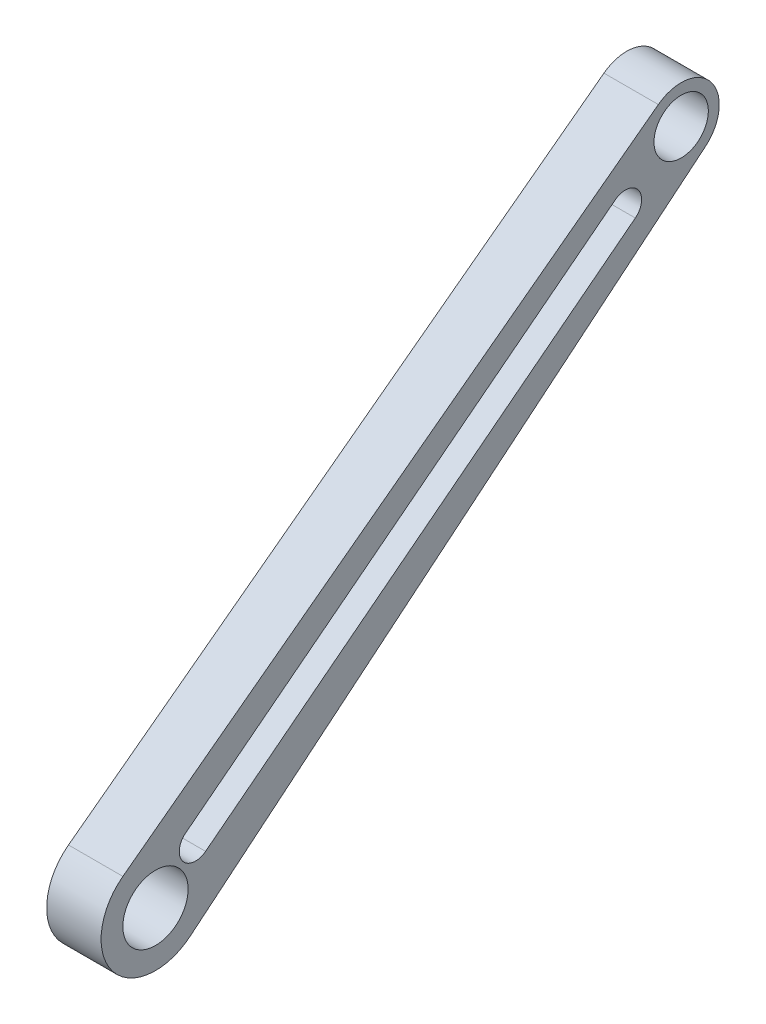
ISO-10303-21;
HEADER;
FILE_DESCRIPTION(('STEP AP214'),'2;1');
FILE_NAME('part.step','',(''),(''),'','','');
FILE_SCHEMA(('AUTOMOTIVE_DESIGN { 1 0 10303 214 1 1 1 1 }'));
ENDSEC;
DATA;
#1=APPLICATION_CONTEXT('core data for automotive mechanical design processes');
#2=APPLICATION_PROTOCOL_DEFINITION('international standard','automotive_design',2000,#1);
#3=PRODUCT_CONTEXT('',#1,'mechanical');
#4=PRODUCT('Part','Part','',(#3));
#5=PRODUCT_RELATED_PRODUCT_CATEGORY('part','',(#4));
#6=PRODUCT_DEFINITION_FORMATION('','',#4);
#7=PRODUCT_DEFINITION_CONTEXT('part definition',#1,'design');
#8=PRODUCT_DEFINITION('design','',#6,#7);
#9=PRODUCT_DEFINITION_SHAPE('','',#8);
#10=(LENGTH_UNIT() NAMED_UNIT(*) SI_UNIT(.MILLI.,.METRE.));
#11=(NAMED_UNIT(*) PLANE_ANGLE_UNIT() SI_UNIT($,.RADIAN.));
#12=(NAMED_UNIT(*) SI_UNIT($,.STERADIAN.) SOLID_ANGLE_UNIT());
#13=UNCERTAINTY_MEASURE_WITH_UNIT(LENGTH_MEASURE(1.E-05),#10,'distance_accuracy_value','');
#14=(GEOMETRIC_REPRESENTATION_CONTEXT(3) GLOBAL_UNCERTAINTY_ASSIGNED_CONTEXT((#13)) GLOBAL_UNIT_ASSIGNED_CONTEXT((#10,
#11,#12)) REPRESENTATION_CONTEXT('',''));
#15=CARTESIAN_POINT('',(0.,0.,0.));
#16=DIRECTION('',(0.,0.,1.));
#17=DIRECTION('',(1.,0.,0.));
#18=AXIS2_PLACEMENT_3D('',#15,#16,#17);
#19=CARTESIAN_POINT('',(50.,0.,0.));
#20=DIRECTION('',(1.,0.,0.));
#21=DIRECTION('',(0.,0.,-1.));
#22=AXIS2_PLACEMENT_3D('',#19,#20,#21);
#23=PLANE('',#22);
#24=CARTESIAN_POINT('',(50.,0.,0.));
#25=DIRECTION('',(1.,0.,0.));
#26=DIRECTION('',(0.,0.,-1.));
#27=AXIS2_PLACEMENT_3D('',#24,#25,#26);
#28=CIRCLE('',#27,30.);
#29=CARTESIAN_POINT('',(50.,0.,-30.));
#30=VERTEX_POINT('',#29);
#31=EDGE_CURVE('E167',#30,#30,#28,.T.);
#32=ORIENTED_EDGE('',*,*,#31,.F.);
#33=EDGE_LOOP('',(#32));
#34=FACE_BOUND('',#33,.T.);
#35=CARTESIAN_POINT('',(50.,0.,0.));
#36=DIRECTION('',(1.,0.,0.));
#37=DIRECTION('',(0.,0.,-1.));
#38=AXIS2_PLACEMENT_3D('',#35,#36,#37);
#39=CIRCLE('',#38,50.);
#40=CARTESIAN_POINT('',(50.,40.0318957961058,29.9574251058019));
#41=VERTEX_POINT('',#40);
#42=CARTESIAN_POINT('',(50.,-38.5229715412484,-31.8744515816691));
#43=VERTEX_POINT('',#42);
#44=EDGE_CURVE('E175',#41,#43,#39,.T.);
#45=ORIENTED_EDGE('',*,*,#44,.T.);
#46=DIRECTION('',(0.,0.637489031633381,-0.770459430824968));
#47=VECTOR('',#46,1.);
#48=CARTESIAN_POINT('',(50.,-38.5229715412484,-31.8744515816691));
#49=LINE('',#48,#47);
#50=CARTESIAN_POINT('',(50.,353.31720598936,-505.446458587129));
#51=VERTEX_POINT('',#50);
#52=EDGE_CURVE('E179',#43,#51,#49,.T.);
#53=ORIENTED_EDGE('',*,*,#52,.T.);
#54=CARTESIAN_POINT('',(50.,380.283286068234,-483.134342479961));
#55=DIRECTION('',(1.,0.,0.));
#56=DIRECTION('',(0.,0.,-1.));
#57=AXIS2_PLACEMENT_3D('',#54,#55,#56);
#58=CIRCLE('',#57,35.);
#59=CARTESIAN_POINT('',(50.,408.305613125508,-462.1641449059));
#60=VERTEX_POINT('',#59);
#61=EDGE_CURVE('E183',#51,#60,#58,.T.);
#62=ORIENTED_EDGE('',*,*,#61,.T.);
#63=DIRECTION('',(0.,-0.599148502116037,0.800637915922116));
#64=VECTOR('',#63,1.);
#65=CARTESIAN_POINT('',(50.,40.0318957961058,29.9574251058019));
#66=LINE('',#65,#64);
#67=EDGE_CURVE('E186',#60,#41,#66,.T.);
#68=ORIENTED_EDGE('',*,*,#67,.T.);
#69=EDGE_LOOP('',(#45,#53,#62,#68));
#70=FACE_BOUND('',#69,.T.);
#71=CARTESIAN_POINT('',(50.,380.283286068234,-483.134342479961));
#72=DIRECTION('',(1.,0.,0.));
#73=DIRECTION('',(0.,0.,-1.));
#74=AXIS2_PLACEMENT_3D('',#71,#72,#73);
#75=CIRCLE('',#74,24.9999999999999);
#76=CARTESIAN_POINT('',(50.,380.283286068234,-508.134342479961));
#77=VERTEX_POINT('',#76);
#78=EDGE_CURVE('E159',#77,#77,#75,.T.);
#79=ORIENTED_EDGE('',*,*,#78,.F.);
#80=EDGE_LOOP('',(#79));
#81=FACE_BOUND('',#80,.T.);
#82=DIRECTION('',(0.,0.613241553660751,-0.789895434132739));
#83=VECTOR('',#82,1.);
#84=CARTESIAN_POINT('',(50.,21.953376737919,-46.0420454998745));
#85=LINE('',#84,#83);
#86=CARTESIAN_POINT('',(50.,21.953376737919,-46.0420454998745));
#87=VERTEX_POINT('',#86);
#88=CARTESIAN_POINT('',(50.,328.574153568294,-440.989762566244));
#89=VERTEX_POINT('',#88);
#90=EDGE_CURVE('E118',#87,#89,#85,.T.);
#91=ORIENTED_EDGE('',*,*,#90,.F.);
#92=CARTESIAN_POINT('',(50.,33.8018082499101,-36.8434221949633));
#93=DIRECTION('',(1.,0.,0.));
#94=DIRECTION('',(0.,0.,-1.));
#95=AXIS2_PLACEMENT_3D('',#92,#93,#94);
#96=CIRCLE('',#95,15.);
#97=CARTESIAN_POINT('',(50.,45.6502397619012,-27.644798890052));
#98=VERTEX_POINT('',#97);
#99=EDGE_CURVE('E109',#98,#87,#96,.T.);
#100=ORIENTED_EDGE('',*,*,#99,.F.);
#101=DIRECTION('',(0.,-0.613241553660751,0.789895434132739));
#102=VECTOR('',#101,1.);
#103=CARTESIAN_POINT('',(50.,45.6502397619012,-27.644798890052));
#104=LINE('',#103,#102);
#105=CARTESIAN_POINT('',(50.,352.271016592277,-422.592515956422));
#106=VERTEX_POINT('',#105);
#107=EDGE_CURVE('E137',#106,#98,#104,.T.);
#108=ORIENTED_EDGE('',*,*,#107,.F.);
#109=CARTESIAN_POINT('',(50.,340.422585080286,-431.791139261333));
#110=DIRECTION('',(1.,0.,0.));
#111=DIRECTION('',(0.,0.,-1.));
#112=AXIS2_PLACEMENT_3D('',#109,#110,#111);
#113=CIRCLE('',#112,15.);
#114=EDGE_CURVE('E131',#89,#106,#113,.T.);
#115=ORIENTED_EDGE('',*,*,#114,.F.);
#116=EDGE_LOOP('',(#91,#100,#108,#115));
#117=FACE_BOUND('',#116,.T.);
#118=ADVANCED_FACE('F43',(#34,#70,#81,#117),#23,.T.);
#119=CARTESIAN_POINT('',(0.,0.,0.));
#120=DIRECTION('',(1.,0.,0.));
#121=DIRECTION('',(0.,0.,-1.));
#122=AXIS2_PLACEMENT_3D('',#119,#120,#121);
#123=PLANE('',#122);
#124=CARTESIAN_POINT('',(0.,380.283286068234,-483.134342479961));
#125=DIRECTION('',(1.,0.,0.));
#126=DIRECTION('',(0.,0.,-1.));
#127=AXIS2_PLACEMENT_3D('',#124,#125,#126);
#128=CIRCLE('',#127,24.9999999999999);
#129=CARTESIAN_POINT('',(0.,380.283286068234,-508.134342479961));
#130=VERTEX_POINT('',#129);
#131=EDGE_CURVE('E127',#130,#130,#128,.T.);
#132=ORIENTED_EDGE('',*,*,#131,.T.);
#133=EDGE_LOOP('',(#132));
#134=FACE_BOUND('',#133,.T.);
#135=CARTESIAN_POINT('',(0.,0.,0.));
#136=DIRECTION('',(1.,0.,0.));
#137=DIRECTION('',(0.,0.,-1.));
#138=AXIS2_PLACEMENT_3D('',#135,#136,#137);
#139=CIRCLE('',#138,30.);
#140=CARTESIAN_POINT('',(0.,0.,-30.));
#141=VERTEX_POINT('',#140);
#142=EDGE_CURVE('E163',#141,#141,#139,.T.);
#143=ORIENTED_EDGE('',*,*,#142,.T.);
#144=EDGE_LOOP('',(#143));
#145=FACE_BOUND('',#144,.T.);
#146=CARTESIAN_POINT('',(0.,0.,0.));
#147=DIRECTION('',(1.,0.,0.));
#148=DIRECTION('',(0.,0.,-1.));
#149=AXIS2_PLACEMENT_3D('',#146,#147,#148);
#150=CIRCLE('',#149,50.);
#151=CARTESIAN_POINT('',(0.,40.0318957961058,29.9574251058019));
#152=VERTEX_POINT('',#151);
#153=CARTESIAN_POINT('',(0.,-38.5229715412484,-31.8744515816691));
#154=VERTEX_POINT('',#153);
#155=EDGE_CURVE('E171',#152,#154,#150,.T.);
#156=ORIENTED_EDGE('',*,*,#155,.F.);
#157=DIRECTION('',(0.,-0.599148502116037,0.800637915922116));
#158=VECTOR('',#157,1.);
#159=CARTESIAN_POINT('',(0.,40.0318957961058,29.9574251058019));
#160=LINE('',#159,#158);
#161=CARTESIAN_POINT('',(0.,408.305613125508,-462.1641449059));
#162=VERTEX_POINT('',#161);
#163=EDGE_CURVE('E180',#162,#152,#160,.T.);
#164=ORIENTED_EDGE('',*,*,#163,.F.);
#165=CARTESIAN_POINT('',(0.,380.283286068234,-483.134342479961));
#166=DIRECTION('',(1.,0.,0.));
#167=DIRECTION('',(0.,0.,-1.));
#168=AXIS2_PLACEMENT_3D('',#165,#166,#167);
#169=CIRCLE('',#168,35.);
#170=CARTESIAN_POINT('',(0.,353.31720598936,-505.446458587129));
#171=VERTEX_POINT('',#170);
#172=EDGE_CURVE('E195',#171,#162,#169,.T.);
#173=ORIENTED_EDGE('',*,*,#172,.F.);
#174=DIRECTION('',(0.,0.637489031633381,-0.770459430824968));
#175=VECTOR('',#174,1.);
#176=CARTESIAN_POINT('',(0.,-38.5229715412484,-31.8744515816691));
#177=LINE('',#176,#175);
#178=EDGE_CURVE('E193',#154,#171,#177,.T.);
#179=ORIENTED_EDGE('',*,*,#178,.F.);
#180=EDGE_LOOP('',(#156,#164,#173,#179));
#181=FACE_BOUND('',#180,.T.);
#182=CARTESIAN_POINT('',(0.,33.8018082499101,-36.8434221949633));
#183=DIRECTION('',(1.,0.,0.));
#184=DIRECTION('',(0.,0.,-1.));
#185=AXIS2_PLACEMENT_3D('',#182,#183,#184);
#186=CIRCLE('',#185,15.);
#187=CARTESIAN_POINT('',(0.,45.6502397619012,-27.644798890052));
#188=VERTEX_POINT('',#187);
#189=CARTESIAN_POINT('',(0.,21.953376737919,-46.0420454998745));
#190=VERTEX_POINT('',#189);
#191=EDGE_CURVE('E67',#188,#190,#186,.T.);
#192=ORIENTED_EDGE('',*,*,#191,.T.);
#193=DIRECTION('',(0.,0.613241553660751,-0.789895434132739));
#194=VECTOR('',#193,1.);
#195=CARTESIAN_POINT('',(0.,21.953376737919,-46.0420454998745));
#196=LINE('',#195,#194);
#197=CARTESIAN_POINT('',(0.,328.574153568294,-440.989762566244));
#198=VERTEX_POINT('',#197);
#199=EDGE_CURVE('E125',#190,#198,#196,.T.);
#200=ORIENTED_EDGE('',*,*,#199,.T.);
#201=CARTESIAN_POINT('',(0.,340.422585080286,-431.791139261333));
#202=DIRECTION('',(1.,0.,0.));
#203=DIRECTION('',(0.,0.,-1.));
#204=AXIS2_PLACEMENT_3D('',#201,#202,#203);
#205=CIRCLE('',#204,15.);
#206=CARTESIAN_POINT('',(0.,352.271016592277,-422.592515956422));
#207=VERTEX_POINT('',#206);
#208=EDGE_CURVE('E146',#198,#207,#205,.T.);
#209=ORIENTED_EDGE('',*,*,#208,.T.);
#210=DIRECTION('',(0.,-0.613241553660751,0.789895434132739));
#211=VECTOR('',#210,1.);
#212=CARTESIAN_POINT('',(0.,45.6502397619012,-27.644798890052));
#213=LINE('',#212,#211);
#214=EDGE_CURVE('E119',#207,#188,#213,.T.);
#215=ORIENTED_EDGE('',*,*,#214,.T.);
#216=EDGE_LOOP('',(#192,#200,#209,#215));
#217=FACE_BOUND('',#216,.T.);
#218=ADVANCED_FACE('F219',(#134,#145,#181,#217),#123,.F.);
#219=CARTESIAN_POINT('',(50.,0.,0.));
#220=DIRECTION('',(-1.,0.,0.));
#221=DIRECTION('',(0.,0.,1.));
#222=AXIS2_PLACEMENT_3D('',#219,#220,#221);
#223=CYLINDRICAL_SURFACE('',#222,50.);
#224=ORIENTED_EDGE('',*,*,#155,.T.);
#225=DIRECTION('',(-1.,0.,0.));
#226=VECTOR('',#225,1.);
#227=CARTESIAN_POINT('',(50.,-38.5229715412484,-31.8744515816691));
#228=LINE('',#227,#226);
#229=EDGE_CURVE('E11',#43,#154,#228,.T.);
#230=ORIENTED_EDGE('',*,*,#229,.F.);
#231=ORIENTED_EDGE('',*,*,#44,.F.);
#232=DIRECTION('',(-1.,0.,0.));
#233=VECTOR('',#232,1.);
#234=CARTESIAN_POINT('',(50.,40.0318957961058,29.9574251058019));
#235=LINE('',#234,#233);
#236=EDGE_CURVE('E189',#41,#152,#235,.T.);
#237=ORIENTED_EDGE('',*,*,#236,.T.);
#238=EDGE_LOOP('',(#224,#230,#231,#237));
#239=FACE_BOUND('',#238,.T.);
#240=ADVANCED_FACE('F45',(#239),#223,.T.);
#241=CARTESIAN_POINT('',(50.,-38.5229715412484,-31.8744515816691));
#242=DIRECTION('',(0.,0.770459430824968,0.637489031633381));
#243=DIRECTION('',(0.,-0.637489031633381,0.770459430824968));
#244=AXIS2_PLACEMENT_3D('',#241,#242,#243);
#245=PLANE('',#244);
#246=ORIENTED_EDGE('',*,*,#178,.T.);
#247=DIRECTION('',(-1.,0.,0.));
#248=VECTOR('',#247,1.);
#249=CARTESIAN_POINT('',(50.,353.31720598936,-505.446458587129));
#250=LINE('',#249,#248);
#251=EDGE_CURVE('E52',#51,#171,#250,.T.);
#252=ORIENTED_EDGE('',*,*,#251,.F.);
#253=ORIENTED_EDGE('',*,*,#52,.F.);
#254=ORIENTED_EDGE('',*,*,#229,.T.);
#255=EDGE_LOOP('',(#246,#252,#253,#254));
#256=FACE_BOUND('',#255,.T.);
#257=ADVANCED_FACE('F230',(#256),#245,.F.);
#258=CARTESIAN_POINT('',(50.,380.283286068234,-483.134342479961));
#259=DIRECTION('',(-1.,0.,0.));
#260=DIRECTION('',(0.,0.,1.));
#261=AXIS2_PLACEMENT_3D('',#258,#259,#260);
#262=CYLINDRICAL_SURFACE('',#261,35.);
#263=ORIENTED_EDGE('',*,*,#172,.T.);
#264=DIRECTION('',(-1.,0.,0.));
#265=VECTOR('',#264,1.);
#266=CARTESIAN_POINT('',(50.,408.305613125508,-462.1641449059));
#267=LINE('',#266,#265);
#268=EDGE_CURVE('E203',#60,#162,#267,.T.);
#269=ORIENTED_EDGE('',*,*,#268,.F.);
#270=ORIENTED_EDGE('',*,*,#61,.F.);
#271=ORIENTED_EDGE('',*,*,#251,.T.);
#272=EDGE_LOOP('',(#263,#269,#270,#271));
#273=FACE_BOUND('',#272,.T.);
#274=ADVANCED_FACE('F213',(#273),#262,.T.);
#275=CARTESIAN_POINT('',(50.,40.0318957961058,29.9574251058019));
#276=DIRECTION('',(0.,-0.800637915922116,-0.599148502116037));
#277=DIRECTION('',(0.,0.599148502116037,-0.800637915922116));
#278=AXIS2_PLACEMENT_3D('',#275,#276,#277);
#279=PLANE('',#278);
#280=ORIENTED_EDGE('',*,*,#163,.T.);
#281=ORIENTED_EDGE('',*,*,#236,.F.);
#282=ORIENTED_EDGE('',*,*,#67,.F.);
#283=ORIENTED_EDGE('',*,*,#268,.T.);
#284=EDGE_LOOP('',(#280,#281,#282,#283));
#285=FACE_BOUND('',#284,.T.);
#286=ADVANCED_FACE('F223',(#285),#279,.F.);
#287=CARTESIAN_POINT('',(50.,0.,0.));
#288=DIRECTION('',(-1.,0.,0.));
#289=DIRECTION('',(0.,0.,1.));
#290=AXIS2_PLACEMENT_3D('',#287,#288,#289);
#291=CYLINDRICAL_SURFACE('',#290,30.);
#292=ORIENTED_EDGE('',*,*,#31,.T.);
#293=EDGE_LOOP('',(#292));
#294=FACE_BOUND('',#293,.T.);
#295=ORIENTED_EDGE('',*,*,#142,.F.);
#296=EDGE_LOOP('',(#295));
#297=FACE_BOUND('',#296,.T.);
#298=ADVANCED_FACE('F247',(#294,#297),#291,.F.);
#299=CARTESIAN_POINT('',(50.,380.283286068234,-483.134342479961));
#300=DIRECTION('',(-1.,0.,0.));
#301=DIRECTION('',(0.,0.,1.));
#302=AXIS2_PLACEMENT_3D('',#299,#300,#301);
#303=CYLINDRICAL_SURFACE('',#302,24.9999999999999);
#304=ORIENTED_EDGE('',*,*,#78,.T.);
#305=EDGE_LOOP('',(#304));
#306=FACE_BOUND('',#305,.T.);
#307=ORIENTED_EDGE('',*,*,#131,.F.);
#308=EDGE_LOOP('',(#307));
#309=FACE_BOUND('',#308,.T.);
#310=ADVANCED_FACE('F254',(#306,#309),#303,.F.);
#311=CARTESIAN_POINT('',(50.,33.8018082499101,-36.8434221949633));
#312=DIRECTION('',(-1.,0.,0.));
#313=DIRECTION('',(0.,0.,1.));
#314=AXIS2_PLACEMENT_3D('',#311,#312,#313);
#315=CYLINDRICAL_SURFACE('',#314,15.);
#316=ORIENTED_EDGE('',*,*,#191,.F.);
#317=DIRECTION('',(-1.,0.,0.));
#318=VECTOR('',#317,1.);
#319=CARTESIAN_POINT('',(50.,45.6502397619012,-27.644798890052));
#320=LINE('',#319,#318);
#321=EDGE_CURVE('E113',#98,#188,#320,.T.);
#322=ORIENTED_EDGE('',*,*,#321,.F.);
#323=ORIENTED_EDGE('',*,*,#99,.T.);
#324=DIRECTION('',(-1.,0.,0.));
#325=VECTOR('',#324,1.);
#326=CARTESIAN_POINT('',(50.,21.953376737919,-46.0420454998745));
#327=LINE('',#326,#325);
#328=EDGE_CURVE('E112',#87,#190,#327,.T.);
#329=ORIENTED_EDGE('',*,*,#328,.T.);
#330=EDGE_LOOP('',(#316,#322,#323,#329));
#331=FACE_BOUND('',#330,.T.);
#332=ADVANCED_FACE('F111',(#331),#315,.F.);
#333=CARTESIAN_POINT('',(50.,21.953376737919,-46.0420454998745));
#334=DIRECTION('',(0.,0.789895434132739,0.613241553660751));
#335=DIRECTION('',(0.,-0.613241553660751,0.789895434132739));
#336=AXIS2_PLACEMENT_3D('',#333,#334,#335);
#337=PLANE('',#336);
#338=ORIENTED_EDGE('',*,*,#199,.F.);
#339=ORIENTED_EDGE('',*,*,#328,.F.);
#340=ORIENTED_EDGE('',*,*,#90,.T.);
#341=DIRECTION('',(-1.,0.,0.));
#342=VECTOR('',#341,1.);
#343=CARTESIAN_POINT('',(50.,328.574153568294,-440.989762566244));
#344=LINE('',#343,#342);
#345=EDGE_CURVE('E128',#89,#198,#344,.T.);
#346=ORIENTED_EDGE('',*,*,#345,.T.);
#347=EDGE_LOOP('',(#338,#339,#340,#346));
#348=FACE_BOUND('',#347,.T.);
#349=ADVANCED_FACE('F122',(#348),#337,.T.);
#350=CARTESIAN_POINT('',(50.,340.422585080286,-431.791139261333));
#351=DIRECTION('',(-1.,0.,0.));
#352=DIRECTION('',(0.,0.,1.));
#353=AXIS2_PLACEMENT_3D('',#350,#351,#352);
#354=CYLINDRICAL_SURFACE('',#353,15.);
#355=ORIENTED_EDGE('',*,*,#208,.F.);
#356=ORIENTED_EDGE('',*,*,#345,.F.);
#357=ORIENTED_EDGE('',*,*,#114,.T.);
#358=DIRECTION('',(-1.,0.,0.));
#359=VECTOR('',#358,1.);
#360=CARTESIAN_POINT('',(50.,352.271016592277,-422.592515956422));
#361=LINE('',#360,#359);
#362=EDGE_CURVE('E59',#106,#207,#361,.T.);
#363=ORIENTED_EDGE('',*,*,#362,.T.);
#364=EDGE_LOOP('',(#355,#356,#357,#363));
#365=FACE_BOUND('',#364,.T.);
#366=ADVANCED_FACE('F271',(#365),#354,.F.);
#367=CARTESIAN_POINT('',(50.,45.6502397619012,-27.644798890052));
#368=DIRECTION('',(0.,-0.789895434132739,-0.613241553660751));
#369=DIRECTION('',(0.,0.613241553660751,-0.789895434132739));
#370=AXIS2_PLACEMENT_3D('',#367,#368,#369);
#371=PLANE('',#370);
#372=ORIENTED_EDGE('',*,*,#214,.F.);
#373=ORIENTED_EDGE('',*,*,#362,.F.);
#374=ORIENTED_EDGE('',*,*,#107,.T.);
#375=ORIENTED_EDGE('',*,*,#321,.T.);
#376=EDGE_LOOP('',(#372,#373,#374,#375));
#377=FACE_BOUND('',#376,.T.);
#378=ADVANCED_FACE('F274',(#377),#371,.T.);
#379=CLOSED_SHELL('',(#118,#218,#240,#257,#274,#286,#298,#310,#332,#349,#366,#378));
#380=MANIFOLD_SOLID_BREP('B2',#379);
#381=ADVANCED_BREP_SHAPE_REPRESENTATION('',(#18,#380),#14);
#382=SHAPE_DEFINITION_REPRESENTATION(#9,#381);
ENDSEC;
END-ISO-10303-21;
